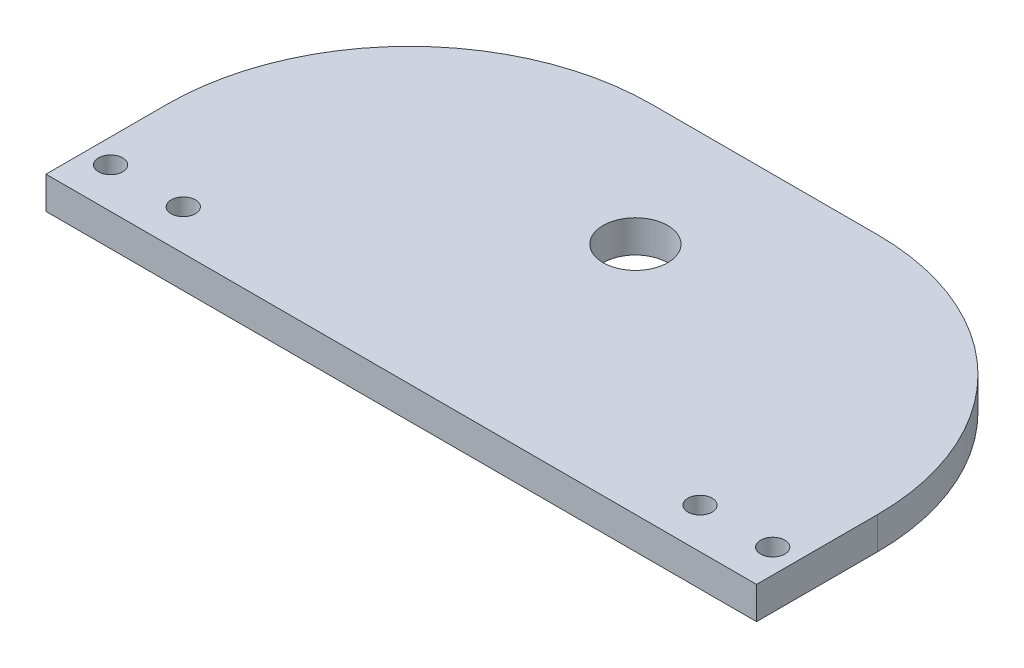
ISO-10303-21;
HEADER;
FILE_DESCRIPTION(('STEP AP214'),'2;1');
FILE_NAME('part.step','',(''),(''),'','','');
FILE_SCHEMA(('AUTOMOTIVE_DESIGN { 1 0 10303 214 1 1 1 1 }'));
ENDSEC;
DATA;
#1=APPLICATION_CONTEXT('core data for automotive mechanical design processes');
#2=APPLICATION_PROTOCOL_DEFINITION('international standard','automotive_design',2000,#1);
#3=PRODUCT_CONTEXT('',#1,'mechanical');
#4=PRODUCT('Part','Part','',(#3));
#5=PRODUCT_RELATED_PRODUCT_CATEGORY('part','',(#4));
#6=PRODUCT_DEFINITION_FORMATION('','',#4);
#7=PRODUCT_DEFINITION_CONTEXT('part definition',#1,'design');
#8=PRODUCT_DEFINITION('design','',#6,#7);
#9=PRODUCT_DEFINITION_SHAPE('','',#8);
#10=(LENGTH_UNIT() NAMED_UNIT(*) SI_UNIT(.MILLI.,.METRE.));
#11=(NAMED_UNIT(*) PLANE_ANGLE_UNIT() SI_UNIT($,.RADIAN.));
#12=(NAMED_UNIT(*) SI_UNIT($,.STERADIAN.) SOLID_ANGLE_UNIT());
#13=UNCERTAINTY_MEASURE_WITH_UNIT(LENGTH_MEASURE(1.E-05),#10,'distance_accuracy_value','');
#14=(GEOMETRIC_REPRESENTATION_CONTEXT(3) GLOBAL_UNCERTAINTY_ASSIGNED_CONTEXT((#13)) GLOBAL_UNIT_ASSIGNED_CONTEXT((#10,
#11,#12)) REPRESENTATION_CONTEXT('',''));
#15=CARTESIAN_POINT('',(0.,0.,0.));
#16=DIRECTION('',(0.,0.,1.));
#17=DIRECTION('',(1.,0.,0.));
#18=AXIS2_PLACEMENT_3D('',#15,#16,#17);
#19=CARTESIAN_POINT('',(44.,4.,-22.5));
#20=DIRECTION('',(-1.,0.,0.));
#21=DIRECTION('',(0.,0.,1.));
#22=AXIS2_PLACEMENT_3D('',#19,#20,#21);
#23=PLANE('',#22);
#24=DIRECTION('',(0.,0.,-1.));
#25=VECTOR('',#24,1.);
#26=CARTESIAN_POINT('',(44.,0.,-22.5));
#27=LINE('',#26,#25);
#28=CARTESIAN_POINT('',(44.,0.,22.5));
#29=VERTEX_POINT('',#28);
#30=CARTESIAN_POINT('',(44.,0.,7.49999999999999));
#31=VERTEX_POINT('',#30);
#32=EDGE_CURVE('E122',#29,#31,#27,.T.);
#33=ORIENTED_EDGE('',*,*,#32,.T.);
#34=DIRECTION('',(0.,-1.,0.));
#35=VECTOR('',#34,1.);
#36=CARTESIAN_POINT('',(44.,4.,7.5));
#37=LINE('',#36,#35);
#38=CARTESIAN_POINT('',(44.,4.,7.49999999999999));
#39=VERTEX_POINT('',#38);
#40=EDGE_CURVE('E62',#31,#39,#37,.F.);
#41=ORIENTED_EDGE('',*,*,#40,.T.);
#42=DIRECTION('',(0.,0.,-1.));
#43=VECTOR('',#42,1.);
#44=CARTESIAN_POINT('',(44.,4.,-22.5));
#45=LINE('',#44,#43);
#46=CARTESIAN_POINT('',(44.,4.,22.5));
#47=VERTEX_POINT('',#46);
#48=EDGE_CURVE('E134',#47,#39,#45,.T.);
#49=ORIENTED_EDGE('',*,*,#48,.F.);
#50=DIRECTION('',(0.,-1.,0.));
#51=VECTOR('',#50,1.);
#52=CARTESIAN_POINT('',(44.,4.,22.5));
#53=LINE('',#52,#51);
#54=EDGE_CURVE('E112',#47,#29,#53,.T.);
#55=ORIENTED_EDGE('',*,*,#54,.T.);
#56=EDGE_LOOP('',(#33,#41,#49,#55));
#57=FACE_BOUND('',#56,.T.);
#58=ADVANCED_FACE('F38',(#57),#23,.F.);
#59=CARTESIAN_POINT('',(-44.,4.,-22.5));
#60=DIRECTION('',(0.,0.,1.));
#61=DIRECTION('',(1.,0.,0.));
#62=AXIS2_PLACEMENT_3D('',#59,#60,#61);
#63=PLANE('',#62);
#64=DIRECTION('',(-1.,0.,0.));
#65=VECTOR('',#64,1.);
#66=CARTESIAN_POINT('',(-44.,4.,-22.5));
#67=LINE('',#66,#65);
#68=CARTESIAN_POINT('',(14.,4.,-22.5));
#69=VERTEX_POINT('',#68);
#70=CARTESIAN_POINT('',(-14.,4.,-22.5));
#71=VERTEX_POINT('',#70);
#72=EDGE_CURVE('E101',#69,#71,#67,.T.);
#73=ORIENTED_EDGE('',*,*,#72,.F.);
#74=DIRECTION('',(0.,-1.,0.));
#75=VECTOR('',#74,1.);
#76=CARTESIAN_POINT('',(14.,4.,-22.5));
#77=LINE('',#76,#75);
#78=CARTESIAN_POINT('',(14.,0.,-22.5));
#79=VERTEX_POINT('',#78);
#80=EDGE_CURVE('E138',#69,#79,#77,.T.);
#81=ORIENTED_EDGE('',*,*,#80,.T.);
#82=DIRECTION('',(-1.,0.,0.));
#83=VECTOR('',#82,1.);
#84=CARTESIAN_POINT('',(-44.,0.,-22.5));
#85=LINE('',#84,#83);
#86=CARTESIAN_POINT('',(-14.,0.,-22.5));
#87=VERTEX_POINT('',#86);
#88=EDGE_CURVE('E125',#79,#87,#85,.T.);
#89=ORIENTED_EDGE('',*,*,#88,.T.);
#90=DIRECTION('',(0.,-1.,0.));
#91=VECTOR('',#90,1.);
#92=CARTESIAN_POINT('',(-14.,4.,-22.5));
#93=LINE('',#92,#91);
#94=EDGE_CURVE('E111',#87,#71,#93,.F.);
#95=ORIENTED_EDGE('',*,*,#94,.T.);
#96=EDGE_LOOP('',(#73,#81,#89,#95));
#97=FACE_BOUND('',#96,.T.);
#98=ADVANCED_FACE('F157',(#97),#63,.F.);
#99=CARTESIAN_POINT('',(-44.,4.,-22.5));
#100=DIRECTION('',(1.,0.,0.));
#101=DIRECTION('',(0.,0.,-1.));
#102=AXIS2_PLACEMENT_3D('',#99,#100,#101);
#103=PLANE('',#102);
#104=DIRECTION('',(0.,0.,1.));
#105=VECTOR('',#104,1.);
#106=CARTESIAN_POINT('',(-44.,4.,-22.5));
#107=LINE('',#106,#105);
#108=CARTESIAN_POINT('',(-44.,4.,7.49999999999999));
#109=VERTEX_POINT('',#108);
#110=CARTESIAN_POINT('',(-44.,4.,22.5));
#111=VERTEX_POINT('',#110);
#112=EDGE_CURVE('E92',#109,#111,#107,.T.);
#113=ORIENTED_EDGE('',*,*,#112,.F.);
#114=DIRECTION('',(0.,-1.,0.));
#115=VECTOR('',#114,1.);
#116=CARTESIAN_POINT('',(-44.,4.,7.5));
#117=LINE('',#116,#115);
#118=CARTESIAN_POINT('',(-44.,0.,7.49999999999999));
#119=VERTEX_POINT('',#118);
#120=EDGE_CURVE('E11',#109,#119,#117,.T.);
#121=ORIENTED_EDGE('',*,*,#120,.T.);
#122=DIRECTION('',(0.,0.,1.));
#123=VECTOR('',#122,1.);
#124=CARTESIAN_POINT('',(-44.,0.,-22.5));
#125=LINE('',#124,#123);
#126=CARTESIAN_POINT('',(-44.,0.,22.5));
#127=VERTEX_POINT('',#126);
#128=EDGE_CURVE('E107',#119,#127,#125,.T.);
#129=ORIENTED_EDGE('',*,*,#128,.T.);
#130=DIRECTION('',(0.,-1.,0.));
#131=VECTOR('',#130,1.);
#132=CARTESIAN_POINT('',(-44.,4.,22.5));
#133=LINE('',#132,#131);
#134=EDGE_CURVE('E104',#111,#127,#133,.T.);
#135=ORIENTED_EDGE('',*,*,#134,.F.);
#136=EDGE_LOOP('',(#113,#121,#129,#135));
#137=FACE_BOUND('',#136,.T.);
#138=ADVANCED_FACE('F105',(#137),#103,.F.);
#139=CARTESIAN_POINT('',(-44.,4.,22.5));
#140=DIRECTION('',(0.,0.,-1.));
#141=DIRECTION('',(-1.,0.,0.));
#142=AXIS2_PLACEMENT_3D('',#139,#140,#141);
#143=PLANE('',#142);
#144=DIRECTION('',(1.,0.,0.));
#145=VECTOR('',#144,1.);
#146=CARTESIAN_POINT('',(-44.,0.,22.5));
#147=LINE('',#146,#145);
#148=EDGE_CURVE('E132',#127,#29,#147,.T.);
#149=ORIENTED_EDGE('',*,*,#148,.T.);
#150=ORIENTED_EDGE('',*,*,#54,.F.);
#151=DIRECTION('',(1.,0.,0.));
#152=VECTOR('',#151,1.);
#153=CARTESIAN_POINT('',(-44.,4.,22.5));
#154=LINE('',#153,#152);
#155=EDGE_CURVE('E96',#111,#47,#154,.T.);
#156=ORIENTED_EDGE('',*,*,#155,.F.);
#157=ORIENTED_EDGE('',*,*,#134,.T.);
#158=EDGE_LOOP('',(#149,#150,#156,#157));
#159=FACE_BOUND('',#158,.T.);
#160=ADVANCED_FACE('F114',(#159),#143,.F.);
#161=CARTESIAN_POINT('',(0.,4.,0.));
#162=DIRECTION('',(0.,1.,0.));
#163=DIRECTION('',(0.,0.,1.));
#164=AXIS2_PLACEMENT_3D('',#161,#162,#163);
#165=PLANE('',#164);
#166=CARTESIAN_POINT('',(-41.,4.,17.5));
#167=DIRECTION('',(0.,1.,0.));
#168=DIRECTION('',(0.,0.,1.));
#169=AXIS2_PLACEMENT_3D('',#166,#167,#168);
#170=CIRCLE('',#169,1.5);
#171=CARTESIAN_POINT('',(-41.,4.,19.));
#172=VERTEX_POINT('',#171);
#173=EDGE_CURVE('E200',#172,#172,#170,.T.);
#174=ORIENTED_EDGE('',*,*,#173,.F.);
#175=EDGE_LOOP('',(#174));
#176=FACE_BOUND('',#175,.T.);
#177=CARTESIAN_POINT('',(-32.,4.,17.5));
#178=DIRECTION('',(0.,1.,0.));
#179=DIRECTION('',(0.,0.,-1.));
#180=AXIS2_PLACEMENT_3D('',#177,#178,#179);
#181=CIRCLE('',#180,1.5);
#182=CARTESIAN_POINT('',(-32.,4.,16.));
#183=VERTEX_POINT('',#182);
#184=EDGE_CURVE('E192',#183,#183,#181,.T.);
#185=ORIENTED_EDGE('',*,*,#184,.F.);
#186=EDGE_LOOP('',(#185));
#187=FACE_BOUND('',#186,.T.);
#188=CARTESIAN_POINT('',(32.,4.,17.5));
#189=DIRECTION('',(0.,1.,0.));
#190=DIRECTION('',(0.,0.,1.));
#191=AXIS2_PLACEMENT_3D('',#188,#189,#190);
#192=CIRCLE('',#191,1.5);
#193=CARTESIAN_POINT('',(32.,4.,19.));
#194=VERTEX_POINT('',#193);
#195=EDGE_CURVE('E184',#194,#194,#192,.T.);
#196=ORIENTED_EDGE('',*,*,#195,.F.);
#197=EDGE_LOOP('',(#196));
#198=FACE_BOUND('',#197,.T.);
#199=CARTESIAN_POINT('',(41.,4.,17.5));
#200=DIRECTION('',(0.,1.,0.));
#201=DIRECTION('',(0.,0.,-1.));
#202=AXIS2_PLACEMENT_3D('',#199,#200,#201);
#203=CIRCLE('',#202,1.5);
#204=CARTESIAN_POINT('',(41.,4.,16.));
#205=VERTEX_POINT('',#204);
#206=EDGE_CURVE('E176',#205,#205,#203,.T.);
#207=ORIENTED_EDGE('',*,*,#206,.F.);
#208=EDGE_LOOP('',(#207));
#209=FACE_BOUND('',#208,.T.);
#210=CARTESIAN_POINT('',(0.,4.,-6.5));
#211=DIRECTION('',(0.,1.,0.));
#212=DIRECTION('',(0.,0.,1.));
#213=AXIS2_PLACEMENT_3D('',#210,#211,#212);
#214=CIRCLE('',#213,4.);
#215=CARTESIAN_POINT('',(0.,4.,-2.5));
#216=VERTEX_POINT('',#215);
#217=EDGE_CURVE('E168',#216,#216,#214,.T.);
#218=ORIENTED_EDGE('',*,*,#217,.F.);
#219=EDGE_LOOP('',(#218));
#220=FACE_BOUND('',#219,.T.);
#221=ORIENTED_EDGE('',*,*,#48,.T.);
#222=CARTESIAN_POINT('',(14.,4.,7.5));
#223=DIRECTION('',(0.,1.,0.));
#224=DIRECTION('',(0.,0.,1.));
#225=AXIS2_PLACEMENT_3D('',#222,#223,#224);
#226=CIRCLE('',#225,30.);
#227=EDGE_CURVE('E47',#39,#69,#226,.T.);
#228=ORIENTED_EDGE('',*,*,#227,.T.);
#229=ORIENTED_EDGE('',*,*,#72,.T.);
#230=CARTESIAN_POINT('',(-14.,4.,7.5));
#231=DIRECTION('',(0.,1.,0.));
#232=DIRECTION('',(0.,0.,1.));
#233=AXIS2_PLACEMENT_3D('',#230,#231,#232);
#234=CIRCLE('',#233,30.);
#235=EDGE_CURVE('E54',#71,#109,#234,.T.);
#236=ORIENTED_EDGE('',*,*,#235,.T.);
#237=ORIENTED_EDGE('',*,*,#112,.T.);
#238=ORIENTED_EDGE('',*,*,#155,.T.);
#239=EDGE_LOOP('',(#221,#228,#229,#236,#237,#238));
#240=FACE_BOUND('',#239,.T.);
#241=ADVANCED_FACE('F94',(#176,#187,#198,#209,#220,#240),#165,.T.);
#242=CARTESIAN_POINT('',(0.,0.,0.));
#243=DIRECTION('',(0.,1.,0.));
#244=DIRECTION('',(0.,0.,1.));
#245=AXIS2_PLACEMENT_3D('',#242,#243,#244);
#246=PLANE('',#245);
#247=CARTESIAN_POINT('',(-41.,0.,17.5));
#248=DIRECTION('',(0.,1.,0.));
#249=DIRECTION('',(0.,0.,1.));
#250=AXIS2_PLACEMENT_3D('',#247,#248,#249);
#251=CIRCLE('',#250,1.5);
#252=CARTESIAN_POINT('',(-41.,0.,19.));
#253=VERTEX_POINT('',#252);
#254=EDGE_CURVE('E172',#253,#253,#251,.T.);
#255=ORIENTED_EDGE('',*,*,#254,.T.);
#256=EDGE_LOOP('',(#255));
#257=FACE_BOUND('',#256,.T.);
#258=CARTESIAN_POINT('',(-32.,0.,17.5));
#259=DIRECTION('',(0.,1.,0.));
#260=DIRECTION('',(0.,0.,-1.));
#261=AXIS2_PLACEMENT_3D('',#258,#259,#260);
#262=CIRCLE('',#261,1.5);
#263=CARTESIAN_POINT('',(-32.,0.,16.));
#264=VERTEX_POINT('',#263);
#265=EDGE_CURVE('E196',#264,#264,#262,.T.);
#266=ORIENTED_EDGE('',*,*,#265,.T.);
#267=EDGE_LOOP('',(#266));
#268=FACE_BOUND('',#267,.T.);
#269=CARTESIAN_POINT('',(32.,0.,17.5));
#270=DIRECTION('',(0.,1.,0.));
#271=DIRECTION('',(0.,0.,1.));
#272=AXIS2_PLACEMENT_3D('',#269,#270,#271);
#273=CIRCLE('',#272,1.5);
#274=CARTESIAN_POINT('',(32.,0.,19.));
#275=VERTEX_POINT('',#274);
#276=EDGE_CURVE('E188',#275,#275,#273,.T.);
#277=ORIENTED_EDGE('',*,*,#276,.T.);
#278=EDGE_LOOP('',(#277));
#279=FACE_BOUND('',#278,.T.);
#280=CARTESIAN_POINT('',(41.,0.,17.5));
#281=DIRECTION('',(0.,1.,0.));
#282=DIRECTION('',(0.,0.,-1.));
#283=AXIS2_PLACEMENT_3D('',#280,#281,#282);
#284=CIRCLE('',#283,1.5);
#285=CARTESIAN_POINT('',(41.,0.,16.));
#286=VERTEX_POINT('',#285);
#287=EDGE_CURVE('E180',#286,#286,#284,.T.);
#288=ORIENTED_EDGE('',*,*,#287,.T.);
#289=EDGE_LOOP('',(#288));
#290=FACE_BOUND('',#289,.T.);
#291=CARTESIAN_POINT('',(0.,0.,-6.5));
#292=DIRECTION('',(0.,1.,0.));
#293=DIRECTION('',(0.,0.,1.));
#294=AXIS2_PLACEMENT_3D('',#291,#292,#293);
#295=CIRCLE('',#294,4.);
#296=CARTESIAN_POINT('',(0.,0.,-2.5));
#297=VERTEX_POINT('',#296);
#298=EDGE_CURVE('E126',#297,#297,#295,.T.);
#299=ORIENTED_EDGE('',*,*,#298,.T.);
#300=EDGE_LOOP('',(#299));
#301=FACE_BOUND('',#300,.T.);
#302=ORIENTED_EDGE('',*,*,#88,.F.);
#303=CARTESIAN_POINT('',(14.,0.,7.5));
#304=DIRECTION('',(0.,1.,0.));
#305=DIRECTION('',(0.,0.,1.));
#306=AXIS2_PLACEMENT_3D('',#303,#304,#305);
#307=CIRCLE('',#306,30.);
#308=EDGE_CURVE('E145',#79,#31,#307,.F.);
#309=ORIENTED_EDGE('',*,*,#308,.T.);
#310=ORIENTED_EDGE('',*,*,#32,.F.);
#311=ORIENTED_EDGE('',*,*,#148,.F.);
#312=ORIENTED_EDGE('',*,*,#128,.F.);
#313=CARTESIAN_POINT('',(-14.,0.,7.5));
#314=DIRECTION('',(0.,1.,0.));
#315=DIRECTION('',(0.,0.,1.));
#316=AXIS2_PLACEMENT_3D('',#313,#314,#315);
#317=CIRCLE('',#316,30.);
#318=EDGE_CURVE('E142',#119,#87,#317,.F.);
#319=ORIENTED_EDGE('',*,*,#318,.T.);
#320=EDGE_LOOP('',(#302,#309,#310,#311,#312,#319));
#321=FACE_BOUND('',#320,.T.);
#322=ADVANCED_FACE('F164',(#257,#268,#279,#290,#301,#321),#246,.F.);
#323=CARTESIAN_POINT('',(0.,0.,-6.5));
#324=DIRECTION('',(0.,1.,0.));
#325=DIRECTION('',(0.,0.,1.));
#326=AXIS2_PLACEMENT_3D('',#323,#324,#325);
#327=CYLINDRICAL_SURFACE('',#326,4.);
#328=ORIENTED_EDGE('',*,*,#298,.F.);
#329=EDGE_LOOP('',(#328));
#330=FACE_BOUND('',#329,.T.);
#331=ORIENTED_EDGE('',*,*,#217,.T.);
#332=EDGE_LOOP('',(#331));
#333=FACE_BOUND('',#332,.T.);
#334=ADVANCED_FACE('F228',(#330,#333),#327,.F.);
#335=CARTESIAN_POINT('',(41.,0.,17.5));
#336=DIRECTION('',(0.,1.,0.));
#337=DIRECTION('',(0.,0.,1.));
#338=AXIS2_PLACEMENT_3D('',#335,#336,#337);
#339=CYLINDRICAL_SURFACE('',#338,1.5);
#340=ORIENTED_EDGE('',*,*,#287,.F.);
#341=EDGE_LOOP('',(#340));
#342=FACE_BOUND('',#341,.T.);
#343=ORIENTED_EDGE('',*,*,#206,.T.);
#344=EDGE_LOOP('',(#343));
#345=FACE_BOUND('',#344,.T.);
#346=ADVANCED_FACE('F230',(#342,#345),#339,.F.);
#347=CARTESIAN_POINT('',(32.,0.,17.5));
#348=DIRECTION('',(0.,1.,0.));
#349=DIRECTION('',(0.,0.,1.));
#350=AXIS2_PLACEMENT_3D('',#347,#348,#349);
#351=CYLINDRICAL_SURFACE('',#350,1.5);
#352=ORIENTED_EDGE('',*,*,#276,.F.);
#353=EDGE_LOOP('',(#352));
#354=FACE_BOUND('',#353,.T.);
#355=ORIENTED_EDGE('',*,*,#195,.T.);
#356=EDGE_LOOP('',(#355));
#357=FACE_BOUND('',#356,.T.);
#358=ADVANCED_FACE('F237',(#354,#357),#351,.F.);
#359=CARTESIAN_POINT('',(-32.,0.,17.5));
#360=DIRECTION('',(0.,1.,0.));
#361=DIRECTION('',(0.,0.,1.));
#362=AXIS2_PLACEMENT_3D('',#359,#360,#361);
#363=CYLINDRICAL_SURFACE('',#362,1.5);
#364=ORIENTED_EDGE('',*,*,#265,.F.);
#365=EDGE_LOOP('',(#364));
#366=FACE_BOUND('',#365,.T.);
#367=ORIENTED_EDGE('',*,*,#184,.T.);
#368=EDGE_LOOP('',(#367));
#369=FACE_BOUND('',#368,.T.);
#370=ADVANCED_FACE('F213',(#366,#369),#363,.F.);
#371=CARTESIAN_POINT('',(-41.,0.,17.5));
#372=DIRECTION('',(0.,1.,0.));
#373=DIRECTION('',(0.,0.,1.));
#374=AXIS2_PLACEMENT_3D('',#371,#372,#373);
#375=CYLINDRICAL_SURFACE('',#374,1.5);
#376=ORIENTED_EDGE('',*,*,#254,.F.);
#377=EDGE_LOOP('',(#376));
#378=FACE_BOUND('',#377,.T.);
#379=ORIENTED_EDGE('',*,*,#173,.T.);
#380=EDGE_LOOP('',(#379));
#381=FACE_BOUND('',#380,.T.);
#382=ADVANCED_FACE('F210',(#378,#381),#375,.F.);
#383=CARTESIAN_POINT('',(14.,4.,7.5));
#384=DIRECTION('',(0.,-1.,0.));
#385=DIRECTION('',(0.,0.,-1.));
#386=AXIS2_PLACEMENT_3D('',#383,#384,#385);
#387=CYLINDRICAL_SURFACE('',#386,30.);
#388=ORIENTED_EDGE('',*,*,#227,.F.);
#389=ORIENTED_EDGE('',*,*,#40,.F.);
#390=ORIENTED_EDGE('',*,*,#308,.F.);
#391=ORIENTED_EDGE('',*,*,#80,.F.);
#392=EDGE_LOOP('',(#388,#389,#390,#391));
#393=FACE_BOUND('',#392,.T.);
#394=ADVANCED_FACE('F161',(#393),#387,.T.);
#395=CARTESIAN_POINT('',(-14.,4.,7.5));
#396=DIRECTION('',(0.,-1.,0.));
#397=DIRECTION('',(0.,0.,-1.));
#398=AXIS2_PLACEMENT_3D('',#395,#396,#397);
#399=CYLINDRICAL_SURFACE('',#398,30.);
#400=ORIENTED_EDGE('',*,*,#235,.F.);
#401=ORIENTED_EDGE('',*,*,#94,.F.);
#402=ORIENTED_EDGE('',*,*,#318,.F.);
#403=ORIENTED_EDGE('',*,*,#120,.F.);
#404=EDGE_LOOP('',(#400,#401,#402,#403));
#405=FACE_BOUND('',#404,.T.);
#406=ADVANCED_FACE('F40',(#405),#399,.T.);
#407=CLOSED_SHELL('',(#58,#98,#138,#160,#241,#322,#334,#346,#358,#370,#382,#394,#406));
#408=MANIFOLD_SOLID_BREP('B2',#407);
#409=ADVANCED_BREP_SHAPE_REPRESENTATION('',(#18,#408),#14);
#410=SHAPE_DEFINITION_REPRESENTATION(#9,#409);
ENDSEC;
END-ISO-10303-21;
